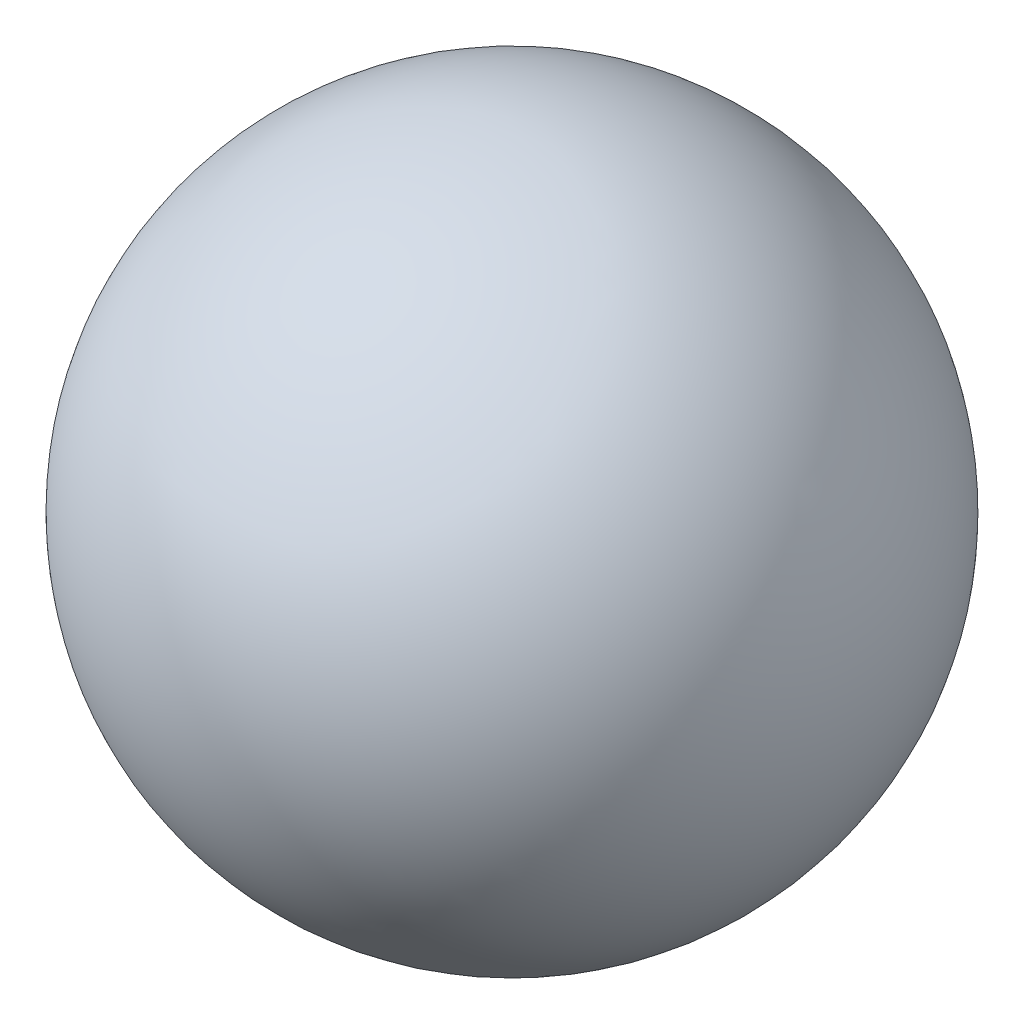
ISO-10303-21;
HEADER;
FILE_DESCRIPTION(('STEP AP214'),'2;1');
FILE_NAME('part.step','',(''),(''),'','','');
FILE_SCHEMA(('AUTOMOTIVE_DESIGN { 1 0 10303 214 1 1 1 1 }'));
ENDSEC;
DATA;
#1=APPLICATION_CONTEXT('core data for automotive mechanical design processes');
#2=APPLICATION_PROTOCOL_DEFINITION('international standard','automotive_design',2000,#1);
#3=PRODUCT_CONTEXT('',#1,'mechanical');
#4=PRODUCT('Part','Part','',(#3));
#5=PRODUCT_RELATED_PRODUCT_CATEGORY('part','',(#4));
#6=PRODUCT_DEFINITION_FORMATION('','',#4);
#7=PRODUCT_DEFINITION_CONTEXT('part definition',#1,'design');
#8=PRODUCT_DEFINITION('design','',#6,#7);
#9=PRODUCT_DEFINITION_SHAPE('','',#8);
#10=(LENGTH_UNIT() NAMED_UNIT(*) SI_UNIT(.MILLI.,.METRE.));
#11=(NAMED_UNIT(*) PLANE_ANGLE_UNIT() SI_UNIT($,.RADIAN.));
#12=(NAMED_UNIT(*) SI_UNIT($,.STERADIAN.) SOLID_ANGLE_UNIT());
#13=UNCERTAINTY_MEASURE_WITH_UNIT(LENGTH_MEASURE(1.E-05),#10,'distance_accuracy_value','');
#14=(GEOMETRIC_REPRESENTATION_CONTEXT(3) GLOBAL_UNCERTAINTY_ASSIGNED_CONTEXT((#13)) GLOBAL_UNIT_ASSIGNED_CONTEXT((#10,
#11,#12)) REPRESENTATION_CONTEXT('',''));
#15=CARTESIAN_POINT('',(0.,0.,0.));
#16=DIRECTION('',(0.,0.,1.));
#17=DIRECTION('',(1.,0.,0.));
#18=AXIS2_PLACEMENT_3D('',#15,#16,#17);
#19=CARTESIAN_POINT('',(-3.43703832126951,-1.98437499999997,0.));
#20=DIRECTION('',(-0.866025403784443,-0.499999999999992,0.));
#21=DIRECTION('',(0.499999999999992,-0.866025403784443,0.));
#22=AXIS2_PLACEMENT_3D('',#19,#20,#21);
#23=SPHERICAL_SURFACE('',#22,0.758760243513405);
#24=CARTESIAN_POINT('',(-4.09414396753379,-2.36375512175666,0.));
#25=VERTEX_POINT('',#24);
#26=VERTEX_LOOP('',#25);
#27=FACE_BOUND('',#26,.T.);
#28=ADVANCED_FACE('F34',(#27),#23,.T.);
#29=CLOSED_SHELL('',(#28));
#30=MANIFOLD_SOLID_BREP('B2',#29);
#31=ADVANCED_BREP_SHAPE_REPRESENTATION('',(#18,#30),#14);
#32=SHAPE_DEFINITION_REPRESENTATION(#9,#31);
ENDSEC;
END-ISO-10303-21;
